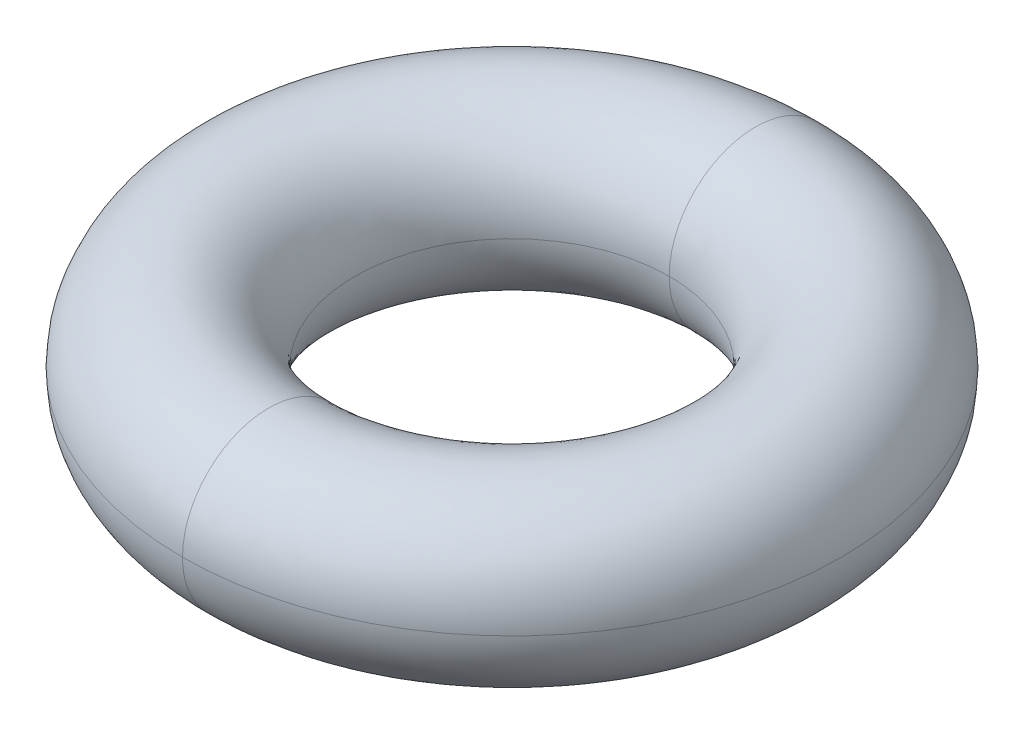
ISO-10303-21;
HEADER;
FILE_DESCRIPTION(('STEP AP214'),'2;1');
FILE_NAME('part.step','',(''),(''),'','','');
FILE_SCHEMA(('AUTOMOTIVE_DESIGN { 1 0 10303 214 1 1 1 1 }'));
ENDSEC;
DATA;
#1=APPLICATION_CONTEXT('core data for automotive mechanical design processes');
#2=APPLICATION_PROTOCOL_DEFINITION('international standard','automotive_design',2000,#1);
#3=PRODUCT_CONTEXT('',#1,'mechanical');
#4=PRODUCT('Part','Part','',(#3));
#5=PRODUCT_RELATED_PRODUCT_CATEGORY('part','',(#4));
#6=PRODUCT_DEFINITION_FORMATION('','',#4);
#7=PRODUCT_DEFINITION_CONTEXT('part definition',#1,'design');
#8=PRODUCT_DEFINITION('design','',#6,#7);
#9=PRODUCT_DEFINITION_SHAPE('','',#8);
#10=(LENGTH_UNIT() NAMED_UNIT(*) SI_UNIT(.MILLI.,.METRE.));
#11=(NAMED_UNIT(*) PLANE_ANGLE_UNIT() SI_UNIT($,.RADIAN.));
#12=(NAMED_UNIT(*) SI_UNIT($,.STERADIAN.) SOLID_ANGLE_UNIT());
#13=UNCERTAINTY_MEASURE_WITH_UNIT(LENGTH_MEASURE(1.E-05),#10,'distance_accuracy_value','');
#14=(GEOMETRIC_REPRESENTATION_CONTEXT(3) GLOBAL_UNCERTAINTY_ASSIGNED_CONTEXT((#13)) GLOBAL_UNIT_ASSIGNED_CONTEXT((#10,
#11,#12)) REPRESENTATION_CONTEXT('',''));
#15=CARTESIAN_POINT('',(0.,0.,0.));
#16=DIRECTION('',(0.,0.,1.));
#17=DIRECTION('',(1.,0.,0.));
#18=AXIS2_PLACEMENT_3D('',#15,#16,#17);
#19=CARTESIAN_POINT('',(0.,0.7145072324,-3.031334552));
#20=CARTESIAN_POINT('',(6.062669104,0.7145072324,-3.031334552));
#21=CARTESIAN_POINT('',(6.062669104,0.7145072324,3.031334552));
#22=CARTESIAN_POINT('',(0.,0.7145072324,3.031334552));
#23=CARTESIAN_POINT('',(0.,1.2147073496,-3.0815219802));
#24=CARTESIAN_POINT('',(6.16304393500001,1.2147073496,-3.0815219802));
#25=CARTESIAN_POINT('',(6.16304393500001,1.2147073496,3.0815219802));
#26=CARTESIAN_POINT('',(0.,1.2147073496,3.0815219802));
#27=CARTESIAN_POINT('',(0.,1.5875,-2.744261593));
#28=CARTESIAN_POINT('',(5.4885231606,1.5875,-2.744261593));
#29=CARTESIAN_POINT('',(5.4885231606,1.5875,2.744261593));
#30=CARTESIAN_POINT('',(0.,1.5875,2.744261593));
#31=CARTESIAN_POINT('',(0.,1.5875,-2.24155));
#32=CARTESIAN_POINT('',(4.4831,1.5875,-2.24155));
#33=CARTESIAN_POINT('',(4.4831,1.5875,2.24155));
#34=CARTESIAN_POINT('',(0.,1.5875,2.24155));
#35=CARTESIAN_POINT('',(0.,1.5875,-1.738838407));
#36=CARTESIAN_POINT('',(3.4776768394,1.5875,-1.738838407));
#37=CARTESIAN_POINT('',(3.4776768394,1.5875,1.738838407));
#38=CARTESIAN_POINT('',(0.,1.5875,1.738838407));
#39=CARTESIAN_POINT('',(0.,1.2147073496,-1.4015780198));
#40=CARTESIAN_POINT('',(2.803156065,1.2147073496,-1.4015780198));
#41=CARTESIAN_POINT('',(2.803156065,1.2147073496,1.4015780198));
#42=CARTESIAN_POINT('',(0.,1.2147073496,1.4015780198));
#43=CARTESIAN_POINT('',(0.,0.7145072324,-1.451765448));
#44=CARTESIAN_POINT('',(2.903530896,0.7145072324,-1.451765448));
#45=CARTESIAN_POINT('',(2.903530896,0.7145072324,1.451765448));
#46=CARTESIAN_POINT('',(0.,0.7145072324,1.451765448));
#47=(BOUNDED_SURFACE() B_SPLINE_SURFACE(3,3,((#19,#20,#21,#22),(#23,#24,#25,#26),(#27,#28,#29,
#30),(#31,#32,#33,#34),(#35,#36,#37,#38),(#39,#40,#41,#42),(#43,#44,#45,#46)),.UNSPECIFIED.,.F.,
.F.,.F.) B_SPLINE_SURFACE_WITH_KNOTS((4,3,4),(4,4),(0.,0.5,1.),(0.,1.),
.UNSPECIFIED.) GEOMETRIC_REPRESENTATION_ITEM() RATIONAL_B_SPLINE_SURFACE(((1.,0.333333333333333,
0.333333333333333,1.),(0.780588314885163,0.260196104961721,0.260196104961721,0.780588314885163),
(0.780588314885163,0.260196104961721,0.260196104961721,0.780588314885163),(1.,0.333333333333333,
0.333333333333333,1.),(0.780588314885163,0.260196104961721,0.260196104961721,0.780588314885163),
(0.780588314885163,0.260196104961721,0.260196104961721,0.780588314885163),(1.,0.333333333333333,
0.333333333333333,1.))) REPRESENTATION_ITEM('') SURFACE());
#48=CARTESIAN_POINT('',(0.,0.793749992404796,1.44780000215657));
#49=CARTESIAN_POINT('',(2.8956000081357,0.793749992404796,1.44780000215657));
#50=CARTESIAN_POINT('',(2.8956000081357,0.793749992404796,-1.44780000215657));
#51=CARTESIAN_POINT('',(0.,0.793749992404796,-1.44780000215657));
#52=(BOUNDED_CURVE() B_SPLINE_CURVE(3,(#48,#49,#50,#51),.UNSPECIFIED.,.F.,
.F.) B_SPLINE_CURVE_WITH_KNOTS((4,4),(0.,1.),
.UNSPECIFIED.) CURVE() GEOMETRIC_REPRESENTATION_ITEM() RATIONAL_B_SPLINE_CURVE((0.959415081908988,
0.319805027302996,0.319805027302996,0.959415081908988)) REPRESENTATION_ITEM(''));
#53=CARTESIAN_POINT('',(0.,0.79375,1.44780000215657));
#54=VERTEX_POINT('',#53);
#55=CARTESIAN_POINT('',(0.,0.79375,-1.44780000215657));
#56=VERTEX_POINT('',#55);
#57=EDGE_CURVE('E74',#54,#56,#52,.T.);
#58=CARTESIAN_POINT('',(0.,0.7145072324,3.031334552));
#59=CARTESIAN_POINT('',(0.,1.2147073496,3.0815219802));
#60=CARTESIAN_POINT('',(0.,1.5875,2.744261593));
#61=CARTESIAN_POINT('',(0.,1.5875,2.24155));
#62=CARTESIAN_POINT('',(0.,1.5875,1.738838407));
#63=CARTESIAN_POINT('',(0.,1.2147073496,1.4015780198));
#64=CARTESIAN_POINT('',(0.,0.7145072324,1.451765448));
#65=(BOUNDED_CURVE() B_SPLINE_CURVE(3,(#58,#59,#60,#61,#62,#63,#64),.UNSPECIFIED.,.F.,
.F.) B_SPLINE_CURVE_WITH_KNOTS((4,3,4),(0.,0.5,1.),
.UNSPECIFIED.) CURVE() GEOMETRIC_REPRESENTATION_ITEM() RATIONAL_B_SPLINE_CURVE((1.,
0.780588314885163,0.780588314885163,1.,0.780588314885163,0.780588314885163,1.)) REPRESENTATION_ITEM(''));
#66=CARTESIAN_POINT('',(0.,0.79375,3.03529999784343));
#67=VERTEX_POINT('',#66);
#68=EDGE_CURVE('E39',#67,#54,#65,.T.);
#69=CARTESIAN_POINT('',(0.,0.793749992404796,-3.03529999784343));
#70=CARTESIAN_POINT('',(6.07059999186429,0.793749992404796,-3.03529999784343));
#71=CARTESIAN_POINT('',(6.07059999186429,0.793749992404796,3.03529999784343));
#72=CARTESIAN_POINT('',(0.,0.793749992404796,3.03529999784343));
#73=(BOUNDED_CURVE() B_SPLINE_CURVE(3,(#69,#70,#71,#72),.UNSPECIFIED.,.F.,
.F.) B_SPLINE_CURVE_WITH_KNOTS((4,4),(0.,1.),
.UNSPECIFIED.) CURVE() GEOMETRIC_REPRESENTATION_ITEM() RATIONAL_B_SPLINE_CURVE((0.959415081908988,
0.319805027302996,0.319805027302996,0.959415081908988)) REPRESENTATION_ITEM(''));
#74=CARTESIAN_POINT('',(0.,0.79375,-3.03529999784343));
#75=VERTEX_POINT('',#74);
#76=EDGE_CURVE('E44',#75,#67,#73,.T.);
#77=CARTESIAN_POINT('',(0.,0.7145072324,-1.451765448));
#78=CARTESIAN_POINT('',(0.,1.2147073496,-1.4015780198));
#79=CARTESIAN_POINT('',(0.,1.5875,-1.738838407));
#80=CARTESIAN_POINT('',(0.,1.5875,-2.24155));
#81=CARTESIAN_POINT('',(0.,1.5875,-2.744261593));
#82=CARTESIAN_POINT('',(0.,1.2147073496,-3.0815219802));
#83=CARTESIAN_POINT('',(0.,0.7145072324,-3.031334552));
#84=(BOUNDED_CURVE() B_SPLINE_CURVE(3,(#77,#78,#79,#80,#81,#82,#83),.UNSPECIFIED.,.F.,
.F.) B_SPLINE_CURVE_WITH_KNOTS((4,3,4),(0.,0.5,1.),
.UNSPECIFIED.) CURVE() GEOMETRIC_REPRESENTATION_ITEM() RATIONAL_B_SPLINE_CURVE((1.,
0.780588314885163,0.780588314885163,1.,0.780588314885163,0.780588314885163,1.)) REPRESENTATION_ITEM(''));
#85=EDGE_CURVE('E68',#56,#75,#84,.T.);
#86=ORIENTED_EDGE('',*,*,#57,.F.);
#87=ORIENTED_EDGE('',*,*,#68,.F.);
#88=ORIENTED_EDGE('',*,*,#76,.F.);
#89=ORIENTED_EDGE('',*,*,#85,.F.);
#90=EDGE_LOOP('',(#86,#87,#88,#89));
#91=FACE_BOUND('',#90,.T.);
#92=ADVANCED_FACE('F17',(#91),#47,.T.);
#93=CARTESIAN_POINT('',(0.,0.8729927676,-1.451765448));
#94=CARTESIAN_POINT('',(2.903530896,0.872992767599999,-1.451765448));
#95=CARTESIAN_POINT('',(2.903530896,0.872992767599999,1.451765448));
#96=CARTESIAN_POINT('',(0.,0.8729927676,1.451765448));
#97=CARTESIAN_POINT('',(0.,0.3727926504,-1.4015780198));
#98=CARTESIAN_POINT('',(2.803156065,0.3727926504,-1.4015780198));
#99=CARTESIAN_POINT('',(2.803156065,0.3727926504,1.4015780198));
#100=CARTESIAN_POINT('',(0.,0.3727926504,1.4015780198));
#101=CARTESIAN_POINT('',(0.,0.,-1.738838407));
#102=CARTESIAN_POINT('',(3.4776768394,0.,-1.738838407));
#103=CARTESIAN_POINT('',(3.4776768394,0.,1.738838407));
#104=CARTESIAN_POINT('',(0.,0.,1.738838407));
#105=CARTESIAN_POINT('',(0.,0.,-2.24155));
#106=CARTESIAN_POINT('',(4.4831,0.,-2.24155));
#107=CARTESIAN_POINT('',(4.4831,0.,2.24155));
#108=CARTESIAN_POINT('',(0.,0.,2.24155));
#109=CARTESIAN_POINT('',(0.,0.,-2.744261593));
#110=CARTESIAN_POINT('',(5.4885231606,0.,-2.744261593));
#111=CARTESIAN_POINT('',(5.4885231606,0.,2.744261593));
#112=CARTESIAN_POINT('',(0.,0.,2.744261593));
#113=CARTESIAN_POINT('',(0.,0.3727926504,-3.0815219802));
#114=CARTESIAN_POINT('',(6.16304393500001,0.3727926504,-3.0815219802));
#115=CARTESIAN_POINT('',(6.16304393500001,0.3727926504,3.0815219802));
#116=CARTESIAN_POINT('',(0.,0.3727926504,3.0815219802));
#117=CARTESIAN_POINT('',(0.,0.8729927676,-3.031334552));
#118=CARTESIAN_POINT('',(6.062669104,0.872992767599999,-3.031334552));
#119=CARTESIAN_POINT('',(6.062669104,0.872992767599999,3.031334552));
#120=CARTESIAN_POINT('',(0.,0.8729927676,3.031334552));
#121=(BOUNDED_SURFACE() B_SPLINE_SURFACE(3,3,((#93,#94,#95,#96),(#97,#98,#99,#100),(#101,#102,
#103,#104),(#105,#106,#107,#108),(#109,#110,#111,#112),(#113,#114,#115,#116),(#117,#118,#119,
#120)),.UNSPECIFIED.,.F.,.F.,.F.) B_SPLINE_SURFACE_WITH_KNOTS((4,3,4),(4,4),(0.,0.5,1.),(0.,1.),
.UNSPECIFIED.) GEOMETRIC_REPRESENTATION_ITEM() RATIONAL_B_SPLINE_SURFACE(((1.,0.333333333333333,
0.333333333333333,1.),(0.780588314885163,0.260196104961721,0.260196104961721,0.780588314885163),
(0.780588314885163,0.260196104961721,0.260196104961721,0.780588314885163),(1.,0.333333333333333,
0.333333333333333,1.),(0.780588314885162,0.260196104961721,0.260196104961721,0.780588314885162),
(0.780588314885162,0.260196104961721,0.260196104961721,0.780588314885162),(1.,0.333333333333333,
0.333333333333333,1.))) REPRESENTATION_ITEM('') SURFACE());
#122=CARTESIAN_POINT('',(0.,0.8729927676,1.451765448));
#123=CARTESIAN_POINT('',(0.,0.3727926504,1.4015780198));
#124=CARTESIAN_POINT('',(0.,0.,1.738838407));
#125=CARTESIAN_POINT('',(0.,0.,2.24155));
#126=CARTESIAN_POINT('',(0.,0.,2.744261593));
#127=CARTESIAN_POINT('',(0.,0.3727926504,3.0815219802));
#128=CARTESIAN_POINT('',(0.,0.8729927676,3.031334552));
#129=(BOUNDED_CURVE() B_SPLINE_CURVE(3,(#122,#123,#124,#125,#126,#127,#128),.UNSPECIFIED.,.F.,
.F.) B_SPLINE_CURVE_WITH_KNOTS((4,3,4),(0.,0.5,1.),
.UNSPECIFIED.) CURVE() GEOMETRIC_REPRESENTATION_ITEM() RATIONAL_B_SPLINE_CURVE((1.,
0.780588314885163,0.780588314885163,1.,0.780588314885162,0.780588314885162,1.)) REPRESENTATION_ITEM(''));
#130=EDGE_CURVE('E78',#54,#67,#129,.T.);
#131=CARTESIAN_POINT('',(0.,0.8729927676,-1.451765448));
#132=CARTESIAN_POINT('',(0.,0.3727926504,-1.4015780198));
#133=CARTESIAN_POINT('',(0.,0.,-1.738838407));
#134=CARTESIAN_POINT('',(0.,0.,-2.24155));
#135=CARTESIAN_POINT('',(0.,0.,-2.744261593));
#136=CARTESIAN_POINT('',(0.,0.3727926504,-3.0815219802));
#137=CARTESIAN_POINT('',(0.,0.8729927676,-3.031334552));
#138=(BOUNDED_CURVE() B_SPLINE_CURVE(3,(#131,#132,#133,#134,#135,#136,#137),.UNSPECIFIED.,.F.,
.F.) B_SPLINE_CURVE_WITH_KNOTS((4,3,4),(0.,0.5,1.),
.UNSPECIFIED.) CURVE() GEOMETRIC_REPRESENTATION_ITEM() RATIONAL_B_SPLINE_CURVE((1.,
0.780588314885163,0.780588314885163,1.,0.780588314885162,0.780588314885162,1.)) REPRESENTATION_ITEM(''));
#139=EDGE_CURVE('E50',#56,#75,#138,.T.);
#140=ORIENTED_EDGE('',*,*,#130,.F.);
#141=ORIENTED_EDGE('',*,*,#57,.T.);
#142=ORIENTED_EDGE('',*,*,#139,.T.);
#143=ORIENTED_EDGE('',*,*,#76,.T.);
#144=EDGE_LOOP('',(#140,#141,#142,#143));
#145=FACE_BOUND('',#144,.T.);
#146=ADVANCED_FACE('F82',(#145),#121,.T.);
#147=CARTESIAN_POINT('',(0.,0.7145072324,3.031334552));
#148=CARTESIAN_POINT('',(-6.062669104,0.7145072324,3.031334552));
#149=CARTESIAN_POINT('',(-6.062669104,0.7145072324,-3.031334552));
#150=CARTESIAN_POINT('',(0.,0.7145072324,-3.031334552));
#151=CARTESIAN_POINT('',(0.,1.2147073496,3.0815219802));
#152=CARTESIAN_POINT('',(-6.16304393500001,1.2147073496,3.0815219802));
#153=CARTESIAN_POINT('',(-6.16304393500001,1.2147073496,-3.0815219802));
#154=CARTESIAN_POINT('',(0.,1.2147073496,-3.0815219802));
#155=CARTESIAN_POINT('',(0.,1.5875,2.744261593));
#156=CARTESIAN_POINT('',(-5.4885231606,1.5875,2.744261593));
#157=CARTESIAN_POINT('',(-5.4885231606,1.5875,-2.744261593));
#158=CARTESIAN_POINT('',(0.,1.5875,-2.744261593));
#159=CARTESIAN_POINT('',(0.,1.5875,2.24155));
#160=CARTESIAN_POINT('',(-4.4831,1.5875,2.24155));
#161=CARTESIAN_POINT('',(-4.4831,1.5875,-2.24155));
#162=CARTESIAN_POINT('',(0.,1.5875,-2.24155));
#163=CARTESIAN_POINT('',(0.,1.5875,1.738838407));
#164=CARTESIAN_POINT('',(-3.4776768394,1.5875,1.738838407));
#165=CARTESIAN_POINT('',(-3.4776768394,1.5875,-1.738838407));
#166=CARTESIAN_POINT('',(0.,1.5875,-1.738838407));
#167=CARTESIAN_POINT('',(0.,1.2147073496,1.4015780198));
#168=CARTESIAN_POINT('',(-2.803156065,1.2147073496,1.4015780198));
#169=CARTESIAN_POINT('',(-2.803156065,1.2147073496,-1.4015780198));
#170=CARTESIAN_POINT('',(0.,1.2147073496,-1.4015780198));
#171=CARTESIAN_POINT('',(0.,0.7145072324,1.451765448));
#172=CARTESIAN_POINT('',(-2.903530896,0.7145072324,1.451765448));
#173=CARTESIAN_POINT('',(-2.903530896,0.7145072324,-1.451765448));
#174=CARTESIAN_POINT('',(0.,0.7145072324,-1.451765448));
#175=(BOUNDED_SURFACE() B_SPLINE_SURFACE(3,3,((#147,#148,#149,#150),(#151,#152,#153,#154),(#155,
#156,#157,#158),(#159,#160,#161,#162),(#163,#164,#165,#166),(#167,#168,#169,#170),(#171,#172,
#173,#174)),.UNSPECIFIED.,.F.,.F.,.F.) B_SPLINE_SURFACE_WITH_KNOTS((4,3,4),(4,4),(0.,0.5,1.),
(0.,1.),.UNSPECIFIED.) GEOMETRIC_REPRESENTATION_ITEM() RATIONAL_B_SPLINE_SURFACE(((1.,
0.333333333333333,0.333333333333333,1.),(0.780588314885163,0.260196104961721,0.260196104961721,
0.780588314885163),(0.780588314885163,0.260196104961721,0.260196104961721,0.780588314885163),
(1.,0.333333333333333,0.333333333333333,1.),(0.780588314885163,0.260196104961721,
0.260196104961721,0.780588314885163),(0.780588314885163,0.260196104961721,0.260196104961721,
0.780588314885163),(1.,0.333333333333333,0.333333333333333,1.))) REPRESENTATION_ITEM('') SURFACE());
#176=CARTESIAN_POINT('',(0.,0.793749992404796,-1.44780000215657));
#177=CARTESIAN_POINT('',(-2.8956000081357,0.793749992404796,-1.44780000215657));
#178=CARTESIAN_POINT('',(-2.8956000081357,0.793749992404796,1.44780000215657));
#179=CARTESIAN_POINT('',(0.,0.793749992404796,1.44780000215657));
#180=(BOUNDED_CURVE() B_SPLINE_CURVE(3,(#176,#177,#178,#179),.UNSPECIFIED.,.F.,
.F.) B_SPLINE_CURVE_WITH_KNOTS((4,4),(0.,1.),
.UNSPECIFIED.) CURVE() GEOMETRIC_REPRESENTATION_ITEM() RATIONAL_B_SPLINE_CURVE((0.959415081908988,
0.319805027302996,0.319805027302996,0.959415081908988)) REPRESENTATION_ITEM(''));
#181=EDGE_CURVE('E11',#56,#54,#180,.T.);
#182=CARTESIAN_POINT('',(0.,0.793749992404796,3.03529999784343));
#183=CARTESIAN_POINT('',(-6.07059999186429,0.793749992404796,3.03529999784343));
#184=CARTESIAN_POINT('',(-6.07059999186429,0.793749992404796,-3.03529999784343));
#185=CARTESIAN_POINT('',(0.,0.793749992404796,-3.03529999784343));
#186=(BOUNDED_CURVE() B_SPLINE_CURVE(3,(#182,#183,#184,#185),.UNSPECIFIED.,.F.,
.F.) B_SPLINE_CURVE_WITH_KNOTS((4,4),(0.,1.),
.UNSPECIFIED.) CURVE() GEOMETRIC_REPRESENTATION_ITEM() RATIONAL_B_SPLINE_CURVE((0.959415081908988,
0.319805027302996,0.319805027302996,0.959415081908988)) REPRESENTATION_ITEM(''));
#187=EDGE_CURVE('E31',#67,#75,#186,.T.);
#188=ORIENTED_EDGE('',*,*,#181,.F.);
#189=ORIENTED_EDGE('',*,*,#85,.T.);
#190=ORIENTED_EDGE('',*,*,#187,.F.);
#191=ORIENTED_EDGE('',*,*,#68,.T.);
#192=EDGE_LOOP('',(#188,#189,#190,#191));
#193=FACE_BOUND('',#192,.T.);
#194=ADVANCED_FACE('F67',(#193),#175,.T.);
#195=CARTESIAN_POINT('',(0.,0.8729927676,1.451765448));
#196=CARTESIAN_POINT('',(-2.903530896,0.872992767599999,1.451765448));
#197=CARTESIAN_POINT('',(-2.903530896,0.872992767599999,-1.451765448));
#198=CARTESIAN_POINT('',(0.,0.8729927676,-1.451765448));
#199=CARTESIAN_POINT('',(0.,0.3727926504,1.4015780198));
#200=CARTESIAN_POINT('',(-2.803156065,0.3727926504,1.4015780198));
#201=CARTESIAN_POINT('',(-2.803156065,0.3727926504,-1.4015780198));
#202=CARTESIAN_POINT('',(0.,0.3727926504,-1.4015780198));
#203=CARTESIAN_POINT('',(0.,0.,1.738838407));
#204=CARTESIAN_POINT('',(-3.4776768394,0.,1.738838407));
#205=CARTESIAN_POINT('',(-3.4776768394,0.,-1.738838407));
#206=CARTESIAN_POINT('',(0.,0.,-1.738838407));
#207=CARTESIAN_POINT('',(0.,0.,2.24155));
#208=CARTESIAN_POINT('',(-4.4831,0.,2.24155));
#209=CARTESIAN_POINT('',(-4.4831,0.,-2.24155));
#210=CARTESIAN_POINT('',(0.,0.,-2.24155));
#211=CARTESIAN_POINT('',(0.,0.,2.744261593));
#212=CARTESIAN_POINT('',(-5.4885231606,0.,2.744261593));
#213=CARTESIAN_POINT('',(-5.4885231606,0.,-2.744261593));
#214=CARTESIAN_POINT('',(0.,0.,-2.744261593));
#215=CARTESIAN_POINT('',(0.,0.3727926504,3.0815219802));
#216=CARTESIAN_POINT('',(-6.16304393500001,0.3727926504,3.0815219802));
#217=CARTESIAN_POINT('',(-6.16304393500001,0.3727926504,-3.0815219802));
#218=CARTESIAN_POINT('',(0.,0.3727926504,-3.0815219802));
#219=CARTESIAN_POINT('',(0.,0.8729927676,3.031334552));
#220=CARTESIAN_POINT('',(-6.062669104,0.872992767599999,3.031334552));
#221=CARTESIAN_POINT('',(-6.062669104,0.872992767599999,-3.031334552));
#222=CARTESIAN_POINT('',(0.,0.8729927676,-3.031334552));
#223=(BOUNDED_SURFACE() B_SPLINE_SURFACE(3,3,((#195,#196,#197,#198),(#199,#200,#201,#202),(#203,
#204,#205,#206),(#207,#208,#209,#210),(#211,#212,#213,#214),(#215,#216,#217,#218),(#219,#220,
#221,#222)),.UNSPECIFIED.,.F.,.F.,.F.) B_SPLINE_SURFACE_WITH_KNOTS((4,3,4),(4,4),(0.,0.5,1.),
(0.,1.),.UNSPECIFIED.) GEOMETRIC_REPRESENTATION_ITEM() RATIONAL_B_SPLINE_SURFACE(((1.,
0.333333333333333,0.333333333333333,1.),(0.780588314885163,0.260196104961721,0.260196104961721,
0.780588314885163),(0.780588314885163,0.260196104961721,0.260196104961721,0.780588314885163),
(1.,0.333333333333333,0.333333333333333,1.),(0.780588314885162,0.260196104961721,
0.260196104961721,0.780588314885162),(0.780588314885162,0.260196104961721,0.260196104961721,
0.780588314885162),(1.,0.333333333333333,0.333333333333333,1.))) REPRESENTATION_ITEM('') SURFACE());
#224=ORIENTED_EDGE('',*,*,#139,.F.);
#225=ORIENTED_EDGE('',*,*,#181,.T.);
#226=ORIENTED_EDGE('',*,*,#130,.T.);
#227=ORIENTED_EDGE('',*,*,#187,.T.);
#228=EDGE_LOOP('',(#224,#225,#226,#227));
#229=FACE_BOUND('',#228,.T.);
#230=ADVANCED_FACE('F53',(#229),#223,.T.);
#231=CLOSED_SHELL('',(#92,#146,#194,#230));
#232=MANIFOLD_SOLID_BREP('B1',#231);
#233=ADVANCED_BREP_SHAPE_REPRESENTATION('',(#18,#232),#14);
#234=SHAPE_DEFINITION_REPRESENTATION(#9,#233);
ENDSEC;
END-ISO-10303-21;
